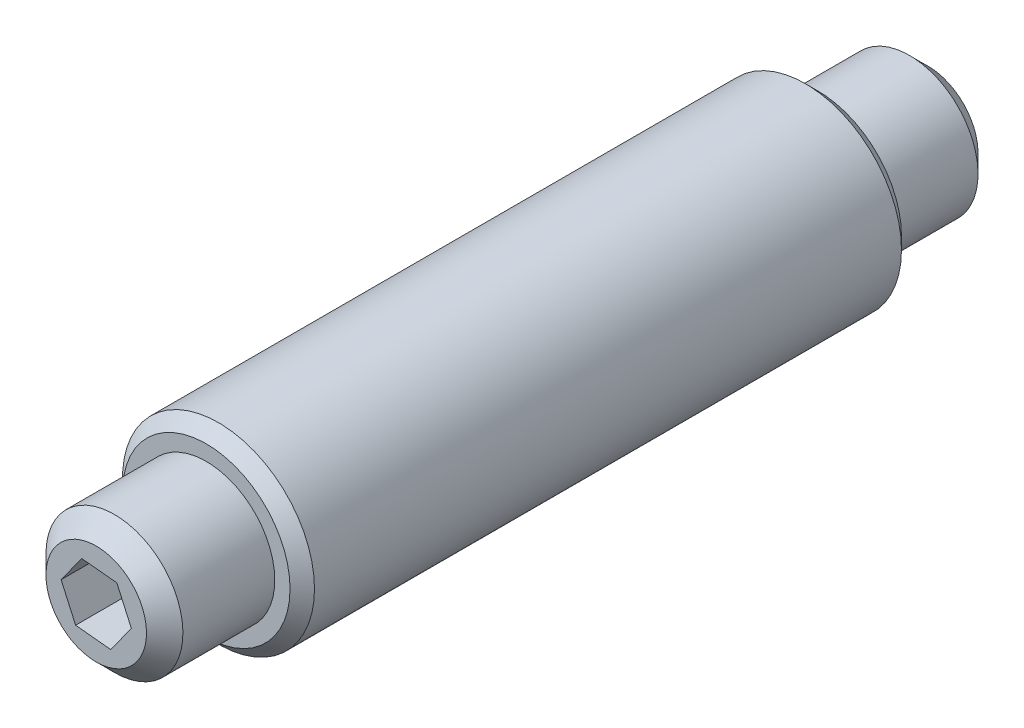
ISO-10303-21;
HEADER;
FILE_DESCRIPTION(('STEP AP214'),'2;1');
FILE_NAME('part.step','',(''),(''),'','','');
FILE_SCHEMA(('AUTOMOTIVE_DESIGN { 1 0 10303 214 1 1 1 1 }'));
ENDSEC;
DATA;
#1=APPLICATION_CONTEXT('core data for automotive mechanical design processes');
#2=APPLICATION_PROTOCOL_DEFINITION('international standard','automotive_design',2000,#1);
#3=PRODUCT_CONTEXT('',#1,'mechanical');
#4=PRODUCT('Part','Part','',(#3));
#5=PRODUCT_RELATED_PRODUCT_CATEGORY('part','',(#4));
#6=PRODUCT_DEFINITION_FORMATION('','',#4);
#7=PRODUCT_DEFINITION_CONTEXT('part definition',#1,'design');
#8=PRODUCT_DEFINITION('design','',#6,#7);
#9=PRODUCT_DEFINITION_SHAPE('','',#8);
#10=(LENGTH_UNIT() NAMED_UNIT(*) SI_UNIT(.MILLI.,.METRE.));
#11=(NAMED_UNIT(*) PLANE_ANGLE_UNIT() SI_UNIT($,.RADIAN.));
#12=(NAMED_UNIT(*) SI_UNIT($,.STERADIAN.) SOLID_ANGLE_UNIT());
#13=UNCERTAINTY_MEASURE_WITH_UNIT(LENGTH_MEASURE(1.E-05),#10,'distance_accuracy_value','');
#14=(GEOMETRIC_REPRESENTATION_CONTEXT(3) GLOBAL_UNCERTAINTY_ASSIGNED_CONTEXT((#13)) GLOBAL_UNIT_ASSIGNED_CONTEXT((#10,
#11,#12)) REPRESENTATION_CONTEXT('',''));
#15=CARTESIAN_POINT('',(0.,0.,0.));
#16=DIRECTION('',(0.,0.,1.));
#17=DIRECTION('',(1.,0.,0.));
#18=AXIS2_PLACEMENT_3D('',#15,#16,#17);
#19=CARTESIAN_POINT('',(0.,0.,6.35));
#20=DIRECTION('',(0.,0.,-1.));
#21=DIRECTION('',(-1.,0.,0.));
#22=AXIS2_PLACEMENT_3D('',#19,#20,#21);
#23=CYLINDRICAL_SURFACE('',#22,1.9939);
#24=CARTESIAN_POINT('',(0.,0.,-6.096));
#25=DIRECTION('',(0.,0.,1.));
#26=DIRECTION('',(1.,0.,0.));
#27=AXIS2_PLACEMENT_3D('',#24,#25,#26);
#28=CIRCLE('',#27,1.9939);
#29=CARTESIAN_POINT('',(1.9939,0.,-6.096));
#30=VERTEX_POINT('',#29);
#31=EDGE_CURVE('P0_E25',#30,#30,#28,.T.);
#32=ORIENTED_EDGE('',*,*,#31,.T.);
#33=EDGE_LOOP('',(#32));
#34=FACE_BOUND('',#33,.T.);
#35=CARTESIAN_POINT('',(0.,0.,6.096));
#36=DIRECTION('',(0.,0.,1.));
#37=DIRECTION('',(1.,0.,0.));
#38=AXIS2_PLACEMENT_3D('',#35,#36,#37);
#39=CIRCLE('',#38,1.9939);
#40=CARTESIAN_POINT('',(1.9939,0.,6.096));
#41=VERTEX_POINT('',#40);
#42=EDGE_CURVE('P0_E66',#41,#41,#39,.F.);
#43=ORIENTED_EDGE('',*,*,#42,.T.);
#44=EDGE_LOOP('',(#43));
#45=FACE_BOUND('',#44,.T.);
#46=ADVANCED_FACE('P0_F17',(#34,#45),#23,.T.);
#47=CARTESIAN_POINT('',(0.,0.,6.35));
#48=DIRECTION('',(0.,0.,1.));
#49=DIRECTION('',(1.,0.,0.));
#50=AXIS2_PLACEMENT_3D('',#47,#48,#49);
#51=PLANE('',#50);
#52=CARTESIAN_POINT('',(0.,0.,6.35));
#53=DIRECTION('',(0.,0.,1.));
#54=DIRECTION('',(1.,0.,0.));
#55=AXIS2_PLACEMENT_3D('',#52,#53,#54);
#56=CIRCLE('',#55,1.4224);
#57=CARTESIAN_POINT('',(1.4224,0.,6.35));
#58=VERTEX_POINT('',#57);
#59=EDGE_CURVE('P0_E60',#58,#58,#56,.T.);
#60=ORIENTED_EDGE('',*,*,#59,.F.);
#61=EDGE_LOOP('',(#60));
#62=FACE_BOUND('',#61,.T.);
#63=CARTESIAN_POINT('',(0.,0.,6.35));
#64=DIRECTION('',(0.,0.,1.));
#65=DIRECTION('',(1.,0.,0.));
#66=AXIS2_PLACEMENT_3D('',#63,#64,#65);
#67=CIRCLE('',#66,1.7399);
#68=CARTESIAN_POINT('',(1.7399,0.,6.35));
#69=VERTEX_POINT('',#68);
#70=EDGE_CURVE('P0_E63',#69,#69,#67,.T.);
#71=ORIENTED_EDGE('',*,*,#70,.T.);
#72=EDGE_LOOP('',(#71));
#73=FACE_BOUND('',#72,.T.);
#74=ADVANCED_FACE('P0_F81',(#62,#73),#51,.T.);
#75=CARTESIAN_POINT('',(0.,0.,-6.35));
#76=DIRECTION('',(0.,0.,1.));
#77=DIRECTION('',(1.,0.,0.));
#78=AXIS2_PLACEMENT_3D('',#75,#76,#77);
#79=PLANE('',#78);
#80=CARTESIAN_POINT('',(0.,0.,-6.35));
#81=DIRECTION('',(0.,0.,1.));
#82=DIRECTION('',(1.,0.,0.));
#83=AXIS2_PLACEMENT_3D('',#80,#81,#82);
#84=CIRCLE('',#83,1.7399);
#85=CARTESIAN_POINT('',(1.7399,0.,-6.35));
#86=VERTEX_POINT('',#85);
#87=EDGE_CURVE('P0_E11',#86,#86,#84,.F.);
#88=ORIENTED_EDGE('',*,*,#87,.T.);
#89=EDGE_LOOP('',(#88));
#90=FACE_BOUND('',#89,.T.);
#91=CARTESIAN_POINT('',(0.,0.,-6.35));
#92=DIRECTION('',(0.,0.,-1.));
#93=DIRECTION('',(-1.,0.,0.));
#94=AXIS2_PLACEMENT_3D('',#91,#92,#93);
#95=CIRCLE('',#94,1.4224);
#96=CARTESIAN_POINT('',(-1.4224,0.,-6.35));
#97=VERTEX_POINT('',#96);
#98=EDGE_CURVE('P0_E48',#97,#97,#95,.T.);
#99=ORIENTED_EDGE('',*,*,#98,.F.);
#100=EDGE_LOOP('',(#99));
#101=FACE_BOUND('',#100,.T.);
#102=ADVANCED_FACE('P0_F87',(#90,#101),#79,.F.);
#103=CARTESIAN_POINT('',(0.,0.,6.35));
#104=DIRECTION('',(0.,0.,-1.));
#105=DIRECTION('',(-1.,0.,0.));
#106=AXIS2_PLACEMENT_3D('',#103,#104,#105);
#107=CONICAL_SURFACE('',#106,1.7399,0.785398163397448);
#108=ORIENTED_EDGE('',*,*,#42,.F.);
#109=EDGE_LOOP('',(#108));
#110=FACE_BOUND('',#109,.T.);
#111=ORIENTED_EDGE('',*,*,#70,.F.);
#112=EDGE_LOOP('',(#111));
#113=FACE_BOUND('',#112,.T.);
#114=ADVANCED_FACE('P0_F91',(#110,#113),#107,.T.);
#115=CARTESIAN_POINT('',(0.,0.,6.35));
#116=DIRECTION('',(0.,0.,1.));
#117=DIRECTION('',(1.,0.,0.));
#118=AXIS2_PLACEMENT_3D('',#115,#116,#117);
#119=CYLINDRICAL_SURFACE('',#118,1.4224);
#120=CARTESIAN_POINT('',(0.,0.,2.286));
#121=DIRECTION('',(0.,0.,1.));
#122=DIRECTION('',(1.,0.,0.));
#123=AXIS2_PLACEMENT_3D('',#120,#121,#122);
#124=CIRCLE('',#123,1.4224);
#125=CARTESIAN_POINT('',(1.4224,0.,2.286));
#126=VERTEX_POINT('',#125);
#127=EDGE_CURVE('P0_E57',#126,#126,#124,.T.);
#128=ORIENTED_EDGE('',*,*,#127,.F.);
#129=EDGE_LOOP('',(#128));
#130=FACE_BOUND('',#129,.T.);
#131=ORIENTED_EDGE('',*,*,#59,.T.);
#132=EDGE_LOOP('',(#131));
#133=FACE_BOUND('',#132,.T.);
#134=ADVANCED_FACE('P0_F93',(#130,#133),#119,.F.);
#135=CARTESIAN_POINT('',(1.1303,0.,2.286));
#136=DIRECTION('',(0.,0.,-1.));
#137=DIRECTION('',(-1.,0.,0.));
#138=AXIS2_PLACEMENT_3D('',#135,#136,#137);
#139=PLANE('',#138);
#140=CARTESIAN_POINT('',(0.,0.,2.286));
#141=DIRECTION('',(0.,0.,1.));
#142=DIRECTION('',(1.,0.,0.));
#143=AXIS2_PLACEMENT_3D('',#140,#141,#142);
#144=CIRCLE('',#143,1.1303);
#145=CARTESIAN_POINT('',(1.1303,0.,2.286));
#146=VERTEX_POINT('',#145);
#147=EDGE_CURVE('P0_E54',#146,#146,#144,.T.);
#148=ORIENTED_EDGE('',*,*,#147,.F.);
#149=EDGE_LOOP('',(#148));
#150=FACE_BOUND('',#149,.T.);
#151=ORIENTED_EDGE('',*,*,#127,.T.);
#152=EDGE_LOOP('',(#151));
#153=FACE_BOUND('',#152,.T.);
#154=ADVANCED_FACE('P0_F100',(#150,#153),#139,.F.);
#155=CARTESIAN_POINT('',(0.,0.,6.35));
#156=DIRECTION('',(0.,0.,1.));
#157=DIRECTION('',(1.,0.,0.));
#158=AXIS2_PLACEMENT_3D('',#155,#156,#157);
#159=CYLINDRICAL_SURFACE('',#158,1.1303);
#160=CARTESIAN_POINT('',(0.,0.,1.27));
#161=DIRECTION('',(0.,0.,1.));
#162=DIRECTION('',(1.,0.,0.));
#163=AXIS2_PLACEMENT_3D('',#160,#161,#162);
#164=CIRCLE('',#163,1.1303);
#165=CARTESIAN_POINT('',(1.1303,0.,1.27));
#166=VERTEX_POINT('',#165);
#167=EDGE_CURVE('P0_E51',#166,#166,#164,.T.);
#168=ORIENTED_EDGE('',*,*,#167,.F.);
#169=EDGE_LOOP('',(#168));
#170=FACE_BOUND('',#169,.T.);
#171=ORIENTED_EDGE('',*,*,#147,.T.);
#172=EDGE_LOOP('',(#171));
#173=FACE_BOUND('',#172,.T.);
#174=ADVANCED_FACE('P0_F115',(#170,#173),#159,.F.);
#175=CARTESIAN_POINT('',(0.,0.,1.27));
#176=DIRECTION('',(0.,0.,1.));
#177=DIRECTION('',(1.,0.,0.));
#178=AXIS2_PLACEMENT_3D('',#175,#176,#177);
#179=CONICAL_SURFACE('',#178,1.1303,1.02974425867665);
#180=CARTESIAN_POINT('',(0.,0.,0.590847242313148));
#181=VERTEX_POINT('',#180);
#182=VERTEX_LOOP('',#181);
#183=FACE_BOUND('',#182,.T.);
#184=ORIENTED_EDGE('',*,*,#167,.T.);
#185=EDGE_LOOP('',(#184));
#186=FACE_BOUND('',#185,.T.);
#187=ADVANCED_FACE('P0_F119',(#183,#186),#179,.F.);
#188=CARTESIAN_POINT('',(0.,0.,-6.35));
#189=DIRECTION('',(0.,0.,-1.));
#190=DIRECTION('',(-1.,0.,0.));
#191=AXIS2_PLACEMENT_3D('',#188,#189,#190);
#192=CYLINDRICAL_SURFACE('',#191,1.4224);
#193=CARTESIAN_POINT('',(0.,0.,-2.286));
#194=DIRECTION('',(0.,0.,-1.));
#195=DIRECTION('',(-1.,0.,0.));
#196=AXIS2_PLACEMENT_3D('',#193,#194,#195);
#197=CIRCLE('',#196,1.4224);
#198=CARTESIAN_POINT('',(-1.4224,0.,-2.286));
#199=VERTEX_POINT('',#198);
#200=EDGE_CURVE('P0_E43',#199,#199,#197,.T.);
#201=ORIENTED_EDGE('',*,*,#200,.F.);
#202=EDGE_LOOP('',(#201));
#203=FACE_BOUND('',#202,.T.);
#204=ORIENTED_EDGE('',*,*,#98,.T.);
#205=EDGE_LOOP('',(#204));
#206=FACE_BOUND('',#205,.T.);
#207=ADVANCED_FACE('P0_F123',(#203,#206),#192,.F.);
#208=CARTESIAN_POINT('',(1.1303,0.,-2.286));
#209=DIRECTION('',(0.,0.,1.));
#210=DIRECTION('',(1.,0.,0.));
#211=AXIS2_PLACEMENT_3D('',#208,#209,#210);
#212=PLANE('',#211);
#213=CARTESIAN_POINT('',(0.,0.,-2.286));
#214=DIRECTION('',(0.,0.,-1.));
#215=DIRECTION('',(-1.,0.,0.));
#216=AXIS2_PLACEMENT_3D('',#213,#214,#215);
#217=CIRCLE('',#216,1.1303);
#218=CARTESIAN_POINT('',(-1.1303,0.,-2.286));
#219=VERTEX_POINT('',#218);
#220=EDGE_CURVE('P0_E40',#219,#219,#217,.T.);
#221=ORIENTED_EDGE('',*,*,#220,.F.);
#222=EDGE_LOOP('',(#221));
#223=FACE_BOUND('',#222,.T.);
#224=ORIENTED_EDGE('',*,*,#200,.T.);
#225=EDGE_LOOP('',(#224));
#226=FACE_BOUND('',#225,.T.);
#227=ADVANCED_FACE('P0_F126',(#223,#226),#212,.F.);
#228=CARTESIAN_POINT('',(0.,0.,-6.35));
#229=DIRECTION('',(0.,0.,-1.));
#230=DIRECTION('',(-1.,0.,0.));
#231=AXIS2_PLACEMENT_3D('',#228,#229,#230);
#232=CYLINDRICAL_SURFACE('',#231,1.1303);
#233=CARTESIAN_POINT('',(0.,0.,-1.27));
#234=DIRECTION('',(0.,0.,-1.));
#235=DIRECTION('',(-1.,0.,0.));
#236=AXIS2_PLACEMENT_3D('',#233,#234,#235);
#237=CIRCLE('',#236,1.1303);
#238=CARTESIAN_POINT('',(-1.1303,0.,-1.27));
#239=VERTEX_POINT('',#238);
#240=EDGE_CURVE('P0_E38',#239,#239,#237,.T.);
#241=ORIENTED_EDGE('',*,*,#240,.F.);
#242=EDGE_LOOP('',(#241));
#243=FACE_BOUND('',#242,.T.);
#244=ORIENTED_EDGE('',*,*,#220,.T.);
#245=EDGE_LOOP('',(#244));
#246=FACE_BOUND('',#245,.T.);
#247=ADVANCED_FACE('P0_F34',(#243,#246),#232,.F.);
#248=CARTESIAN_POINT('',(0.,0.,-1.27));
#249=DIRECTION('',(0.,0.,-1.));
#250=DIRECTION('',(-1.,0.,0.));
#251=AXIS2_PLACEMENT_3D('',#248,#249,#250);
#252=CONICAL_SURFACE('',#251,1.1303,1.02974425867665);
#253=CARTESIAN_POINT('',(0.,0.,-0.590847242313148));
#254=VERTEX_POINT('',#253);
#255=VERTEX_LOOP('',#254);
#256=FACE_BOUND('',#255,.T.);
#257=ORIENTED_EDGE('',*,*,#240,.T.);
#258=EDGE_LOOP('',(#257));
#259=FACE_BOUND('',#258,.T.);
#260=ADVANCED_FACE('P0_F31',(#256,#259),#252,.F.);
#261=CARTESIAN_POINT('',(0.,0.,-6.096));
#262=DIRECTION('',(0.,0.,1.));
#263=DIRECTION('',(1.,0.,0.));
#264=AXIS2_PLACEMENT_3D('',#261,#262,#263);
#265=CONICAL_SURFACE('',#264,1.9939,0.785398163397448);
#266=ORIENTED_EDGE('',*,*,#87,.F.);
#267=EDGE_LOOP('',(#266));
#268=FACE_BOUND('',#267,.T.);
#269=ORIENTED_EDGE('',*,*,#31,.F.);
#270=EDGE_LOOP('',(#269));
#271=FACE_BOUND('',#270,.T.);
#272=ADVANCED_FACE('P0_F19',(#268,#271),#265,.T.);
#273=CLOSED_SHELL('',(#46,#74,#102,#114,#134,#154,#174,#187,#207,#227,#247,#260,#272));
#274=MANIFOLD_SOLID_BREP('P0_B1',#273);
#275=CARTESIAN_POINT('',(0.,0.,-8.636));
#276=DIRECTION('',(0.,0.,-1.));
#277=DIRECTION('',(-0.761416587019638,-0.648262894982711,0.));
#278=AXIS2_PLACEMENT_3D('',#275,#276,#277);
#279=PLANE('',#278);
#280=CARTESIAN_POINT('',(0.,0.,-8.636));
#281=DIRECTION('',(0.,0.,-1.));
#282=DIRECTION('',(-0.761416587019638,-0.648262894982711,0.));
#283=AXIS2_PLACEMENT_3D('',#280,#281,#282);
#284=CIRCLE('',#283,1.04394);
#285=CARTESIAN_POINT('',(-0.794873231853282,-0.676747566588252,-8.636));
#286=VERTEX_POINT('',#285);
#287=EDGE_CURVE('P1_E11',#286,#286,#284,.T.);
#288=ORIENTED_EDGE('',*,*,#287,.T.);
#289=EDGE_LOOP('',(#288));
#290=FACE_BOUND('',#289,.T.);
#291=DIRECTION('',(0.761416587019639,0.648262894982711,0.));
#292=VECTOR('',#291,1.);
#293=CARTESIAN_POINT('',(-0.690795523704608,0.245835062110788,-8.636));
#294=LINE('',#293,#292);
#295=CARTESIAN_POINT('',(-0.690795523704608,0.245835062110788,-8.636));
#296=VERTEX_POINT('',#295);
#297=CARTESIAN_POINT('',(-0.132498352923441,0.721164003404159,-8.636));
#298=VERTEX_POINT('',#297);
#299=EDGE_CURVE('P1_E78',#296,#298,#294,.T.);
#300=ORIENTED_EDGE('',*,*,#299,.F.);
#301=DIRECTION('',(0.180703841876052,-0.983537554713207,0.));
#302=VECTOR('',#301,1.);
#303=CARTESIAN_POINT('',(-0.690795523704608,0.245835062110788,-8.636));
#304=LINE('',#303,#302);
#305=CARTESIAN_POINT('',(-0.558297170781171,-0.475328941293368,-8.636));
#306=VERTEX_POINT('',#305);
#307=EDGE_CURVE('P1_E31',#296,#306,#304,.T.);
#308=ORIENTED_EDGE('',*,*,#307,.T.);
#309=DIRECTION('',(-0.942120428895691,0.335274659730496,0.));
#310=VECTOR('',#309,1.);
#311=CARTESIAN_POINT('',(0.132498352923435,-0.721164003404153,-8.636));
#312=LINE('',#311,#310);
#313=CARTESIAN_POINT('',(0.132498352923435,-0.721164003404153,-8.636));
#314=VERTEX_POINT('',#313);
#315=EDGE_CURVE('P1_E84',#314,#306,#312,.T.);
#316=ORIENTED_EDGE('',*,*,#315,.F.);
#317=DIRECTION('',(0.761416587019638,0.648262894982711,0.));
#318=VECTOR('',#317,1.);
#319=CARTESIAN_POINT('',(0.132498352923435,-0.721164003404153,-8.636));
#320=LINE('',#319,#318);
#321=CARTESIAN_POINT('',(0.690795523704602,-0.245835062110782,-8.636));
#322=VERTEX_POINT('',#321);
#323=EDGE_CURVE('P1_E104',#314,#322,#320,.T.);
#324=ORIENTED_EDGE('',*,*,#323,.T.);
#325=DIRECTION('',(-0.180703841876052,0.983537554713207,0.));
#326=VECTOR('',#325,1.);
#327=CARTESIAN_POINT('',(0.690795523704602,-0.245835062110782,-8.636));
#328=LINE('',#327,#326);
#329=CARTESIAN_POINT('',(0.558297170781164,0.475328941293374,-8.636));
#330=VERTEX_POINT('',#329);
#331=EDGE_CURVE('P1_E107',#322,#330,#328,.T.);
#332=ORIENTED_EDGE('',*,*,#331,.T.);
#333=DIRECTION('',(0.942120428895691,-0.335274659730496,0.));
#334=VECTOR('',#333,1.);
#335=CARTESIAN_POINT('',(-0.132498352923441,0.721164003404159,-8.636));
#336=LINE('',#335,#334);
#337=EDGE_CURVE('P1_E110',#298,#330,#336,.T.);
#338=ORIENTED_EDGE('',*,*,#337,.F.);
#339=EDGE_LOOP('',(#300,#308,#316,#324,#332,#338));
#340=FACE_BOUND('',#339,.T.);
#341=ADVANCED_FACE('P1_F17',(#290,#340),#279,.T.);
#342=CARTESIAN_POINT('',(0.,0.,-8.636));
#343=DIRECTION('',(0.,0.,1.));
#344=DIRECTION('',(0.761416587019638,0.648262894982711,0.));
#345=AXIS2_PLACEMENT_3D('',#342,#343,#344);
#346=CONICAL_SURFACE('',#345,1.04394,0.785398163397426);
#347=CARTESIAN_POINT('',(0.,0.,-8.25753999999998));
#348=DIRECTION('',(0.,0.,-1.));
#349=DIRECTION('',(-0.761416587019638,-0.648262894982711,0.));
#350=AXIS2_PLACEMENT_3D('',#347,#348,#349);
#351=CIRCLE('',#350,1.4224);
#352=CARTESIAN_POINT('',(-1.08303895337673,-0.922089141823408,-8.25753999999998));
#353=VERTEX_POINT('',#352);
#354=EDGE_CURVE('P1_E24',#353,#353,#351,.T.);
#355=ORIENTED_EDGE('',*,*,#354,.T.);
#356=EDGE_LOOP('',(#355));
#357=FACE_BOUND('',#356,.T.);
#358=ORIENTED_EDGE('',*,*,#287,.F.);
#359=EDGE_LOOP('',(#358));
#360=FACE_BOUND('',#359,.T.);
#361=ADVANCED_FACE('P1_F130',(#357,#360),#346,.T.);
#362=CARTESIAN_POINT('',(0.,0.,-21.336));
#363=DIRECTION('',(0.,0.,-1.));
#364=DIRECTION('',(-0.761416587019638,-0.648262894982711,0.));
#365=AXIS2_PLACEMENT_3D('',#362,#363,#364);
#366=CYLINDRICAL_SURFACE('',#365,1.4224);
#367=CARTESIAN_POINT('',(0.,0.,-5.83494976935411));
#368=DIRECTION('',(0.,0.,-1.));
#369=DIRECTION('',(-0.761416587019638,-0.648262894982711,0.));
#370=AXIS2_PLACEMENT_3D('',#367,#368,#369);
#371=CIRCLE('',#370,1.4224);
#372=CARTESIAN_POINT('',(-1.08303895337673,-0.922089141823408,-5.83494976935411));
#373=VERTEX_POINT('',#372);
#374=EDGE_CURVE('P1_E125',#373,#373,#371,.T.);
#375=ORIENTED_EDGE('',*,*,#374,.T.);
#376=EDGE_LOOP('',(#375));
#377=FACE_BOUND('',#376,.T.);
#378=ORIENTED_EDGE('',*,*,#354,.F.);
#379=EDGE_LOOP('',(#378));
#380=FACE_BOUND('',#379,.T.);
#381=ADVANCED_FACE('P1_F133',(#377,#380),#366,.T.);
#382=CARTESIAN_POINT('',(0.,0.,-5.83494976935411));
#383=DIRECTION('',(0.,0.,-1.));
#384=DIRECTION('',(-0.761416587019638,-0.648262894982711,0.));
#385=AXIS2_PLACEMENT_3D('',#382,#383,#384);
#386=CONICAL_SURFACE('',#385,1.4224,1.0471975511966);
#387=CARTESIAN_POINT('',(0.,0.,-5.461));
#388=DIRECTION('',(0.,0.,-1.));
#389=DIRECTION('',(-0.761416587019638,-0.648262894982711,0.));
#390=AXIS2_PLACEMENT_3D('',#387,#388,#389);
#391=CIRCLE('',#390,0.7747);
#392=CARTESIAN_POINT('',(-0.589869429964114,-0.502209264743106,-5.461));
#393=VERTEX_POINT('',#392);
#394=EDGE_CURVE('P1_E85',#393,#393,#391,.T.);
#395=ORIENTED_EDGE('',*,*,#394,.T.);
#396=EDGE_LOOP('',(#395));
#397=FACE_BOUND('',#396,.T.);
#398=ORIENTED_EDGE('',*,*,#374,.F.);
#399=EDGE_LOOP('',(#398));
#400=FACE_BOUND('',#399,.T.);
#401=ADVANCED_FACE('P1_F135',(#397,#400),#386,.T.);
#402=CARTESIAN_POINT('',(0.,0.,-5.92648672156064));
#403=DIRECTION('',(0.,0.,1.));
#404=DIRECTION('',(0.761416587019638,0.648262894982711,0.));
#405=AXIS2_PLACEMENT_3D('',#402,#403,#404);
#406=CONICAL_SURFACE('',#405,0.,1.02974425867666);
#407=ORIENTED_EDGE('',*,*,#394,.F.);
#408=EDGE_LOOP('',(#407));
#409=FACE_BOUND('',#408,.T.);
#410=CARTESIAN_POINT('',(0.,0.,-5.92648672156064));
#411=VERTEX_POINT('',#410);
#412=VERTEX_LOOP('',#411);
#413=FACE_BOUND('',#412,.T.);
#414=ADVANCED_FACE('P1_F143',(#409,#413),#406,.F.);
#415=CARTESIAN_POINT('',(-0.690795523704608,0.245835062110788,-6.858));
#416=DIRECTION('',(0.983537554713207,0.180703841876052,0.));
#417=DIRECTION('',(-0.180703841876052,0.983537554713207,0.));
#418=AXIS2_PLACEMENT_3D('',#415,#416,#417);
#419=PLANE('',#418);
#420=ORIENTED_EDGE('',*,*,#307,.F.);
#421=DIRECTION('',(0.,0.,-1.));
#422=VECTOR('',#421,1.);
#423=CARTESIAN_POINT('',(-0.690795523704608,0.245835062110788,-6.858));
#424=LINE('',#423,#422);
#425=CARTESIAN_POINT('',(-0.690795523704608,0.245835062110788,-6.858));
#426=VERTEX_POINT('',#425);
#427=EDGE_CURVE('P1_E72',#426,#296,#424,.T.);
#428=ORIENTED_EDGE('',*,*,#427,.F.);
#429=DIRECTION('',(0.180703841876052,-0.983537554713207,0.));
#430=VECTOR('',#429,1.);
#431=CARTESIAN_POINT('',(-0.690795523704608,0.245835062110788,-6.858));
#432=LINE('',#431,#430);
#433=CARTESIAN_POINT('',(-0.558297170781171,-0.475328941293368,-6.858));
#434=VERTEX_POINT('',#433);
#435=EDGE_CURVE('P1_E67',#426,#434,#432,.T.);
#436=ORIENTED_EDGE('',*,*,#435,.T.);
#437=DIRECTION('',(0.,0.,-1.));
#438=VECTOR('',#437,1.);
#439=CARTESIAN_POINT('',(-0.558297170781171,-0.475328941293368,-6.858));
#440=LINE('',#439,#438);
#441=EDGE_CURVE('P1_E70',#434,#306,#440,.T.);
#442=ORIENTED_EDGE('',*,*,#441,.T.);
#443=EDGE_LOOP('',(#420,#428,#436,#442));
#444=FACE_BOUND('',#443,.T.);
#445=ADVANCED_FACE('P1_F69',(#444),#419,.T.);
#446=CARTESIAN_POINT('',(0.132498352923435,-0.721164003404153,-6.858));
#447=DIRECTION('',(-0.335274659730496,-0.942120428895691,0.));
#448=DIRECTION('',(0.942120428895691,-0.335274659730496,0.));
#449=AXIS2_PLACEMENT_3D('',#446,#447,#448);
#450=PLANE('',#449);
#451=ORIENTED_EDGE('',*,*,#315,.T.);
#452=ORIENTED_EDGE('',*,*,#441,.F.);
#453=DIRECTION('',(-0.942120428895691,0.335274659730496,0.));
#454=VECTOR('',#453,1.);
#455=CARTESIAN_POINT('',(0.132498352923435,-0.721164003404153,-6.858));
#456=LINE('',#455,#454);
#457=CARTESIAN_POINT('',(0.132498352923435,-0.721164003404153,-6.858));
#458=VERTEX_POINT('',#457);
#459=EDGE_CURVE('P1_E77',#458,#434,#456,.T.);
#460=ORIENTED_EDGE('',*,*,#459,.F.);
#461=DIRECTION('',(0.,0.,-1.));
#462=VECTOR('',#461,1.);
#463=CARTESIAN_POINT('',(0.132498352923435,-0.721164003404153,-6.858));
#464=LINE('',#463,#462);
#465=EDGE_CURVE('P1_E86',#458,#314,#464,.T.);
#466=ORIENTED_EDGE('',*,*,#465,.T.);
#467=EDGE_LOOP('',(#451,#452,#460,#466));
#468=FACE_BOUND('',#467,.T.);
#469=ADVANCED_FACE('P1_F82',(#468),#450,.F.);
#470=CARTESIAN_POINT('',(0.132498352923435,-0.721164003404153,-6.858));
#471=DIRECTION('',(-0.648262894982711,0.761416587019638,0.));
#472=DIRECTION('',(-0.761416587019638,-0.648262894982711,0.));
#473=AXIS2_PLACEMENT_3D('',#470,#471,#472);
#474=PLANE('',#473);
#475=ORIENTED_EDGE('',*,*,#323,.F.);
#476=ORIENTED_EDGE('',*,*,#465,.F.);
#477=DIRECTION('',(0.761416587019638,0.648262894982711,0.));
#478=VECTOR('',#477,1.);
#479=CARTESIAN_POINT('',(0.132498352923435,-0.721164003404153,-6.858));
#480=LINE('',#479,#478);
#481=CARTESIAN_POINT('',(0.690795523704602,-0.245835062110782,-6.858));
#482=VERTEX_POINT('',#481);
#483=EDGE_CURVE('P1_E91',#458,#482,#480,.T.);
#484=ORIENTED_EDGE('',*,*,#483,.T.);
#485=DIRECTION('',(0.,0.,-1.));
#486=VECTOR('',#485,1.);
#487=CARTESIAN_POINT('',(0.690795523704602,-0.245835062110782,-6.858));
#488=LINE('',#487,#486);
#489=EDGE_CURVE('P1_E120',#482,#322,#488,.T.);
#490=ORIENTED_EDGE('',*,*,#489,.T.);
#491=EDGE_LOOP('',(#475,#476,#484,#490));
#492=FACE_BOUND('',#491,.T.);
#493=ADVANCED_FACE('P1_F166',(#492),#474,.T.);
#494=CARTESIAN_POINT('',(0.690795523704602,-0.245835062110782,-6.858));
#495=DIRECTION('',(-0.983537554713207,-0.180703841876052,0.));
#496=DIRECTION('',(0.180703841876052,-0.983537554713207,0.));
#497=AXIS2_PLACEMENT_3D('',#494,#495,#496);
#498=PLANE('',#497);
#499=ORIENTED_EDGE('',*,*,#331,.F.);
#500=ORIENTED_EDGE('',*,*,#489,.F.);
#501=DIRECTION('',(-0.180703841876052,0.983537554713207,0.));
#502=VECTOR('',#501,1.);
#503=CARTESIAN_POINT('',(0.690795523704602,-0.245835062110782,-6.858));
#504=LINE('',#503,#502);
#505=CARTESIAN_POINT('',(0.558297170781164,0.475328941293374,-6.858));
#506=VERTEX_POINT('',#505);
#507=EDGE_CURVE('P1_E93',#482,#506,#504,.T.);
#508=ORIENTED_EDGE('',*,*,#507,.T.);
#509=DIRECTION('',(0.,0.,-1.));
#510=VECTOR('',#509,1.);
#511=CARTESIAN_POINT('',(0.558297170781164,0.475328941293374,-6.858));
#512=LINE('',#511,#510);
#513=EDGE_CURVE('P1_E118',#506,#330,#512,.T.);
#514=ORIENTED_EDGE('',*,*,#513,.T.);
#515=EDGE_LOOP('',(#499,#500,#508,#514));
#516=FACE_BOUND('',#515,.T.);
#517=ADVANCED_FACE('P1_F162',(#516),#498,.T.);
#518=CARTESIAN_POINT('',(-0.132498352923441,0.721164003404159,-6.858));
#519=DIRECTION('',(0.335274659730496,0.942120428895691,0.));
#520=DIRECTION('',(-0.942120428895691,0.335274659730496,0.));
#521=AXIS2_PLACEMENT_3D('',#518,#519,#520);
#522=PLANE('',#521);
#523=ORIENTED_EDGE('',*,*,#337,.T.);
#524=ORIENTED_EDGE('',*,*,#513,.F.);
#525=DIRECTION('',(0.942120428895691,-0.335274659730496,0.));
#526=VECTOR('',#525,1.);
#527=CARTESIAN_POINT('',(-0.132498352923441,0.721164003404159,-6.858));
#528=LINE('',#527,#526);
#529=CARTESIAN_POINT('',(-0.132498352923441,0.721164003404159,-6.858));
#530=VERTEX_POINT('',#529);
#531=EDGE_CURVE('P1_E97',#530,#506,#528,.T.);
#532=ORIENTED_EDGE('',*,*,#531,.F.);
#533=DIRECTION('',(0.,0.,-1.));
#534=VECTOR('',#533,1.);
#535=CARTESIAN_POINT('',(-0.132498352923441,0.721164003404159,-6.858));
#536=LINE('',#535,#534);
#537=EDGE_CURVE('P1_E116',#530,#298,#536,.T.);
#538=ORIENTED_EDGE('',*,*,#537,.T.);
#539=EDGE_LOOP('',(#523,#524,#532,#538));
#540=FACE_BOUND('',#539,.T.);
#541=ADVANCED_FACE('P1_F159',(#540),#522,.F.);
#542=CARTESIAN_POINT('',(-0.690795523704608,0.245835062110788,-6.858));
#543=DIRECTION('',(-0.648262894982711,0.761416587019639,0.));
#544=DIRECTION('',(-0.761416587019639,-0.648262894982711,0.));
#545=AXIS2_PLACEMENT_3D('',#542,#543,#544);
#546=PLANE('',#545);
#547=ORIENTED_EDGE('',*,*,#299,.T.);
#548=ORIENTED_EDGE('',*,*,#537,.F.);
#549=DIRECTION('',(0.761416587019639,0.648262894982711,0.));
#550=VECTOR('',#549,1.);
#551=CARTESIAN_POINT('',(-0.690795523704608,0.245835062110788,-6.858));
#552=LINE('',#551,#550);
#553=EDGE_CURVE('P1_E100',#426,#530,#552,.T.);
#554=ORIENTED_EDGE('',*,*,#553,.F.);
#555=ORIENTED_EDGE('',*,*,#427,.T.);
#556=EDGE_LOOP('',(#547,#548,#554,#555));
#557=FACE_BOUND('',#556,.T.);
#558=ADVANCED_FACE('P1_F155',(#557),#546,.F.);
#559=CARTESIAN_POINT('',(-0.558297170781171,-0.475328941293368,-6.858));
#560=DIRECTION('',(0.,0.,-1.));
#561=DIRECTION('',(-0.761416587019638,-0.648262894982711,0.));
#562=AXIS2_PLACEMENT_3D('',#559,#560,#561);
#563=PLANE('',#562);
#564=ORIENTED_EDGE('',*,*,#435,.F.);
#565=ORIENTED_EDGE('',*,*,#553,.T.);
#566=ORIENTED_EDGE('',*,*,#531,.T.);
#567=ORIENTED_EDGE('',*,*,#507,.F.);
#568=ORIENTED_EDGE('',*,*,#483,.F.);
#569=ORIENTED_EDGE('',*,*,#459,.T.);
#570=EDGE_LOOP('',(#564,#565,#566,#567,#568,#569));
#571=FACE_BOUND('',#570,.T.);
#572=ADVANCED_FACE('P1_F89',(#571),#563,.T.);
#573=CLOSED_SHELL('',(#341,#361,#381,#401,#414,#445,#469,#493,#517,#541,#558,#572));
#574=MANIFOLD_SOLID_BREP('P1_B1',#573);
#575=CARTESIAN_POINT('',(0.,0.,8.636));
#576=DIRECTION('',(0.,0.,1.));
#577=DIRECTION('',(0.995012738844344,-0.0997479299909404,0.));
#578=AXIS2_PLACEMENT_3D('',#575,#576,#577);
#579=PLANE('',#578);
#580=CARTESIAN_POINT('',(0.,0.,8.636));
#581=DIRECTION('',(0.,0.,1.));
#582=DIRECTION('',(0.995012738844344,-0.0997479299909404,0.));
#583=AXIS2_PLACEMENT_3D('',#580,#581,#582);
#584=CIRCLE('',#583,1.04394);
#585=CARTESIAN_POINT('',(1.03873359858917,-0.104130854034742,8.636));
#586=VERTEX_POINT('',#585);
#587=EDGE_CURVE('P2_E10',#586,#586,#584,.T.);
#588=ORIENTED_EDGE('',*,*,#587,.T.);
#589=EDGE_LOOP('',(#588));
#590=FACE_BOUND('',#589,.T.);
#591=DIRECTION('',(-0.995012738844344,0.0997479299909403,0.));
#592=VECTOR('',#591,1.);
#593=CARTESIAN_POINT('',(0.428128939657242,0.595263760329238,8.636));
#594=LINE('',#593,#592);
#595=CARTESIAN_POINT('',(0.428128939657242,0.595263760329238,8.636));
#596=VERTEX_POINT('',#595);
#597=CARTESIAN_POINT('',(-0.301449068568746,0.668402418003087,8.636));
#598=VERTEX_POINT('',#597);
#599=EDGE_CURVE('P2_E77',#596,#598,#594,.T.);
#600=ORIENTED_EDGE('',*,*,#599,.F.);
#601=DIRECTION('',(0.411122128075106,-0.911580273923803,0.));
#602=VECTOR('',#601,1.);
#603=CARTESIAN_POINT('',(0.428128939657242,0.595263760329238,8.636));
#604=LINE('',#603,#602);
#605=CARTESIAN_POINT('',(0.72957800822599,-0.073138657673845,8.636));
#606=VERTEX_POINT('',#605);
#607=EDGE_CURVE('P2_E30',#596,#606,#604,.T.);
#608=ORIENTED_EDGE('',*,*,#607,.T.);
#609=DIRECTION('',(0.583890610769238,0.811832343932863,0.));
#610=VECTOR('',#609,1.);
#611=CARTESIAN_POINT('',(0.301449068568748,-0.668402418003079,8.636));
#612=LINE('',#611,#610);
#613=CARTESIAN_POINT('',(0.301449068568748,-0.668402418003079,8.636));
#614=VERTEX_POINT('',#613);
#615=EDGE_CURVE('P2_E83',#614,#606,#612,.T.);
#616=ORIENTED_EDGE('',*,*,#615,.F.);
#617=DIRECTION('',(-0.995012738844344,0.0997479299909404,0.));
#618=VECTOR('',#617,1.);
#619=CARTESIAN_POINT('',(0.301449068568748,-0.668402418003079,8.636));
#620=LINE('',#619,#618);
#621=CARTESIAN_POINT('',(-0.42812893965724,-0.595263760329229,8.636));
#622=VERTEX_POINT('',#621);
#623=EDGE_CURVE('P2_E103',#614,#622,#620,.T.);
#624=ORIENTED_EDGE('',*,*,#623,.T.);
#625=DIRECTION('',(-0.411122128075106,0.911580273923803,0.));
#626=VECTOR('',#625,1.);
#627=CARTESIAN_POINT('',(-0.42812893965724,-0.595263760329229,8.636));
#628=LINE('',#627,#626);
#629=CARTESIAN_POINT('',(-0.729578008225988,0.0731386576738534,8.636));
#630=VERTEX_POINT('',#629);
#631=EDGE_CURVE('P2_E106',#622,#630,#628,.T.);
#632=ORIENTED_EDGE('',*,*,#631,.T.);
#633=DIRECTION('',(-0.583890610769238,-0.811832343932863,0.));
#634=VECTOR('',#633,1.);
#635=CARTESIAN_POINT('',(-0.301449068568746,0.668402418003087,8.636));
#636=LINE('',#635,#634);
#637=EDGE_CURVE('P2_E109',#598,#630,#636,.T.);
#638=ORIENTED_EDGE('',*,*,#637,.F.);
#639=EDGE_LOOP('',(#600,#608,#616,#624,#632,#638));
#640=FACE_BOUND('',#639,.T.);
#641=ADVANCED_FACE('P2_F16',(#590,#640),#579,.T.);
#642=CARTESIAN_POINT('',(0.,0.,8.636));
#643=DIRECTION('',(0.,0.,-1.));
#644=DIRECTION('',(-0.995012738844344,0.0997479299909404,0.));
#645=AXIS2_PLACEMENT_3D('',#642,#643,#644);
#646=CONICAL_SURFACE('',#645,1.04394,0.785398163397426);
#647=CARTESIAN_POINT('',(0.,0.,8.25753999999998));
#648=DIRECTION('',(0.,0.,1.));
#649=DIRECTION('',(0.995012738844344,-0.0997479299909404,0.));
#650=AXIS2_PLACEMENT_3D('',#647,#648,#649);
#651=CIRCLE('',#650,1.4224);
#652=CARTESIAN_POINT('',(1.41530611973219,-0.141881455619114,8.25753999999998));
#653=VERTEX_POINT('',#652);
#654=EDGE_CURVE('P2_E23',#653,#653,#651,.T.);
#655=ORIENTED_EDGE('',*,*,#654,.T.);
#656=EDGE_LOOP('',(#655));
#657=FACE_BOUND('',#656,.T.);
#658=ORIENTED_EDGE('',*,*,#587,.F.);
#659=EDGE_LOOP('',(#658));
#660=FACE_BOUND('',#659,.T.);
#661=ADVANCED_FACE('P2_F129',(#657,#660),#646,.T.);
#662=CARTESIAN_POINT('',(0.,0.,21.336));
#663=DIRECTION('',(0.,0.,1.));
#664=DIRECTION('',(0.995012738844344,-0.0997479299909404,0.));
#665=AXIS2_PLACEMENT_3D('',#662,#663,#664);
#666=CYLINDRICAL_SURFACE('',#665,1.4224);
#667=CARTESIAN_POINT('',(0.,0.,5.83494976935411));
#668=DIRECTION('',(0.,0.,1.));
#669=DIRECTION('',(0.995012738844344,-0.0997479299909404,0.));
#670=AXIS2_PLACEMENT_3D('',#667,#668,#669);
#671=CIRCLE('',#670,1.4224);
#672=CARTESIAN_POINT('',(1.41530611973219,-0.141881455619114,5.83494976935411));
#673=VERTEX_POINT('',#672);
#674=EDGE_CURVE('P2_E124',#673,#673,#671,.T.);
#675=ORIENTED_EDGE('',*,*,#674,.T.);
#676=EDGE_LOOP('',(#675));
#677=FACE_BOUND('',#676,.T.);
#678=ORIENTED_EDGE('',*,*,#654,.F.);
#679=EDGE_LOOP('',(#678));
#680=FACE_BOUND('',#679,.T.);
#681=ADVANCED_FACE('P2_F132',(#677,#680),#666,.T.);
#682=CARTESIAN_POINT('',(0.,0.,5.83494976935411));
#683=DIRECTION('',(0.,0.,1.));
#684=DIRECTION('',(0.995012738844344,-0.0997479299909404,0.));
#685=AXIS2_PLACEMENT_3D('',#682,#683,#684);
#686=CONICAL_SURFACE('',#685,1.4224,1.0471975511966);
#687=CARTESIAN_POINT('',(0.,0.,5.461));
#688=DIRECTION('',(0.,0.,1.));
#689=DIRECTION('',(0.995012738844344,-0.0997479299909404,0.));
#690=AXIS2_PLACEMENT_3D('',#687,#688,#689);
#691=CIRCLE('',#690,0.7747);
#692=CARTESIAN_POINT('',(0.770836368782713,-0.0772747213639815,5.461));
#693=VERTEX_POINT('',#692);
#694=EDGE_CURVE('P2_E84',#693,#693,#691,.T.);
#695=ORIENTED_EDGE('',*,*,#694,.T.);
#696=EDGE_LOOP('',(#695));
#697=FACE_BOUND('',#696,.T.);
#698=ORIENTED_EDGE('',*,*,#674,.F.);
#699=EDGE_LOOP('',(#698));
#700=FACE_BOUND('',#699,.T.);
#701=ADVANCED_FACE('P2_F134',(#697,#700),#686,.T.);
#702=CARTESIAN_POINT('',(0.,0.,5.92648672156064));
#703=DIRECTION('',(0.,0.,-1.));
#704=DIRECTION('',(-0.995012738844344,0.0997479299909404,0.));
#705=AXIS2_PLACEMENT_3D('',#702,#703,#704);
#706=CONICAL_SURFACE('',#705,0.,1.02974425867666);
#707=ORIENTED_EDGE('',*,*,#694,.F.);
#708=EDGE_LOOP('',(#707));
#709=FACE_BOUND('',#708,.T.);
#710=CARTESIAN_POINT('',(0.,0.,5.92648672156064));
#711=VERTEX_POINT('',#710);
#712=VERTEX_LOOP('',#711);
#713=FACE_BOUND('',#712,.T.);
#714=ADVANCED_FACE('P2_F142',(#709,#713),#706,.F.);
#715=CARTESIAN_POINT('',(0.428128939657242,0.595263760329238,6.858));
#716=DIRECTION('',(-0.911580273923803,-0.411122128075106,0.));
#717=DIRECTION('',(-0.411122128075106,0.911580273923803,0.));
#718=AXIS2_PLACEMENT_3D('',#715,#716,#717);
#719=PLANE('',#718);
#720=ORIENTED_EDGE('',*,*,#607,.F.);
#721=DIRECTION('',(0.,0.,1.));
#722=VECTOR('',#721,1.);
#723=CARTESIAN_POINT('',(0.428128939657242,0.595263760329238,6.858));
#724=LINE('',#723,#722);
#725=CARTESIAN_POINT('',(0.428128939657242,0.595263760329238,6.858));
#726=VERTEX_POINT('',#725);
#727=EDGE_CURVE('P2_E71',#726,#596,#724,.T.);
#728=ORIENTED_EDGE('',*,*,#727,.F.);
#729=DIRECTION('',(0.411122128075106,-0.911580273923803,0.));
#730=VECTOR('',#729,1.);
#731=CARTESIAN_POINT('',(0.428128939657242,0.595263760329238,6.858));
#732=LINE('',#731,#730);
#733=CARTESIAN_POINT('',(0.72957800822599,-0.073138657673845,6.858));
#734=VERTEX_POINT('',#733);
#735=EDGE_CURVE('P2_E66',#726,#734,#732,.T.);
#736=ORIENTED_EDGE('',*,*,#735,.T.);
#737=DIRECTION('',(0.,0.,1.));
#738=VECTOR('',#737,1.);
#739=CARTESIAN_POINT('',(0.72957800822599,-0.073138657673845,6.858));
#740=LINE('',#739,#738);
#741=EDGE_CURVE('P2_E69',#734,#606,#740,.T.);
#742=ORIENTED_EDGE('',*,*,#741,.T.);
#743=EDGE_LOOP('',(#720,#728,#736,#742));
#744=FACE_BOUND('',#743,.T.);
#745=ADVANCED_FACE('P2_F68',(#744),#719,.T.);
#746=CARTESIAN_POINT('',(0.301449068568748,-0.668402418003079,6.858));
#747=DIRECTION('',(0.811832343932863,-0.583890610769238,0.));
#748=DIRECTION('',(-0.583890610769238,-0.811832343932863,0.));
#749=AXIS2_PLACEMENT_3D('',#746,#747,#748);
#750=PLANE('',#749);
#751=ORIENTED_EDGE('',*,*,#615,.T.);
#752=ORIENTED_EDGE('',*,*,#741,.F.);
#753=DIRECTION('',(0.583890610769238,0.811832343932863,0.));
#754=VECTOR('',#753,1.);
#755=CARTESIAN_POINT('',(0.301449068568748,-0.668402418003079,6.858));
#756=LINE('',#755,#754);
#757=CARTESIAN_POINT('',(0.301449068568748,-0.668402418003079,6.858));
#758=VERTEX_POINT('',#757);
#759=EDGE_CURVE('P2_E76',#758,#734,#756,.T.);
#760=ORIENTED_EDGE('',*,*,#759,.F.);
#761=DIRECTION('',(0.,0.,1.));
#762=VECTOR('',#761,1.);
#763=CARTESIAN_POINT('',(0.301449068568748,-0.668402418003079,6.858));
#764=LINE('',#763,#762);
#765=EDGE_CURVE('P2_E85',#758,#614,#764,.T.);
#766=ORIENTED_EDGE('',*,*,#765,.T.);
#767=EDGE_LOOP('',(#751,#752,#760,#766));
#768=FACE_BOUND('',#767,.T.);
#769=ADVANCED_FACE('P2_F81',(#768),#750,.F.);
#770=CARTESIAN_POINT('',(0.301449068568748,-0.668402418003079,6.858));
#771=DIRECTION('',(0.0997479299909404,0.995012738844344,0.));
#772=DIRECTION('',(0.995012738844344,-0.0997479299909404,0.));
#773=AXIS2_PLACEMENT_3D('',#770,#771,#772);
#774=PLANE('',#773);
#775=ORIENTED_EDGE('',*,*,#623,.F.);
#776=ORIENTED_EDGE('',*,*,#765,.F.);
#777=DIRECTION('',(-0.995012738844344,0.0997479299909404,0.));
#778=VECTOR('',#777,1.);
#779=CARTESIAN_POINT('',(0.301449068568748,-0.668402418003079,6.858));
#780=LINE('',#779,#778);
#781=CARTESIAN_POINT('',(-0.42812893965724,-0.595263760329229,6.858));
#782=VERTEX_POINT('',#781);
#783=EDGE_CURVE('P2_E90',#758,#782,#780,.T.);
#784=ORIENTED_EDGE('',*,*,#783,.T.);
#785=DIRECTION('',(0.,0.,1.));
#786=VECTOR('',#785,1.);
#787=CARTESIAN_POINT('',(-0.42812893965724,-0.595263760329229,6.858));
#788=LINE('',#787,#786);
#789=EDGE_CURVE('P2_E119',#782,#622,#788,.T.);
#790=ORIENTED_EDGE('',*,*,#789,.T.);
#791=EDGE_LOOP('',(#775,#776,#784,#790));
#792=FACE_BOUND('',#791,.T.);
#793=ADVANCED_FACE('P2_F165',(#792),#774,.T.);
#794=CARTESIAN_POINT('',(-0.42812893965724,-0.595263760329229,6.858));
#795=DIRECTION('',(0.911580273923803,0.411122128075106,0.));
#796=DIRECTION('',(0.411122128075106,-0.911580273923803,0.));
#797=AXIS2_PLACEMENT_3D('',#794,#795,#796);
#798=PLANE('',#797);
#799=ORIENTED_EDGE('',*,*,#631,.F.);
#800=ORIENTED_EDGE('',*,*,#789,.F.);
#801=DIRECTION('',(-0.411122128075106,0.911580273923803,0.));
#802=VECTOR('',#801,1.);
#803=CARTESIAN_POINT('',(-0.42812893965724,-0.595263760329229,6.858));
#804=LINE('',#803,#802);
#805=CARTESIAN_POINT('',(-0.729578008225988,0.0731386576738534,6.858));
#806=VERTEX_POINT('',#805);
#807=EDGE_CURVE('P2_E92',#782,#806,#804,.T.);
#808=ORIENTED_EDGE('',*,*,#807,.T.);
#809=DIRECTION('',(0.,0.,1.));
#810=VECTOR('',#809,1.);
#811=CARTESIAN_POINT('',(-0.729578008225988,0.0731386576738534,6.858));
#812=LINE('',#811,#810);
#813=EDGE_CURVE('P2_E117',#806,#630,#812,.T.);
#814=ORIENTED_EDGE('',*,*,#813,.T.);
#815=EDGE_LOOP('',(#799,#800,#808,#814));
#816=FACE_BOUND('',#815,.T.);
#817=ADVANCED_FACE('P2_F161',(#816),#798,.T.);
#818=CARTESIAN_POINT('',(-0.301449068568746,0.668402418003087,6.858));
#819=DIRECTION('',(-0.811832343932863,0.583890610769238,0.));
#820=DIRECTION('',(0.583890610769238,0.811832343932863,0.));
#821=AXIS2_PLACEMENT_3D('',#818,#819,#820);
#822=PLANE('',#821);
#823=ORIENTED_EDGE('',*,*,#637,.T.);
#824=ORIENTED_EDGE('',*,*,#813,.F.);
#825=DIRECTION('',(-0.583890610769238,-0.811832343932863,0.));
#826=VECTOR('',#825,1.);
#827=CARTESIAN_POINT('',(-0.301449068568746,0.668402418003087,6.858));
#828=LINE('',#827,#826);
#829=CARTESIAN_POINT('',(-0.301449068568746,0.668402418003087,6.858));
#830=VERTEX_POINT('',#829);
#831=EDGE_CURVE('P2_E96',#830,#806,#828,.T.);
#832=ORIENTED_EDGE('',*,*,#831,.F.);
#833=DIRECTION('',(0.,0.,1.));
#834=VECTOR('',#833,1.);
#835=CARTESIAN_POINT('',(-0.301449068568746,0.668402418003087,6.858));
#836=LINE('',#835,#834);
#837=EDGE_CURVE('P2_E115',#830,#598,#836,.T.);
#838=ORIENTED_EDGE('',*,*,#837,.T.);
#839=EDGE_LOOP('',(#823,#824,#832,#838));
#840=FACE_BOUND('',#839,.T.);
#841=ADVANCED_FACE('P2_F158',(#840),#822,.F.);
#842=CARTESIAN_POINT('',(0.428128939657242,0.595263760329238,6.858));
#843=DIRECTION('',(0.0997479299909403,0.995012738844344,0.));
#844=DIRECTION('',(0.995012738844344,-0.0997479299909403,0.));
#845=AXIS2_PLACEMENT_3D('',#842,#843,#844);
#846=PLANE('',#845);
#847=ORIENTED_EDGE('',*,*,#599,.T.);
#848=ORIENTED_EDGE('',*,*,#837,.F.);
#849=DIRECTION('',(-0.995012738844344,0.0997479299909403,0.));
#850=VECTOR('',#849,1.);
#851=CARTESIAN_POINT('',(0.428128939657242,0.595263760329238,6.858));
#852=LINE('',#851,#850);
#853=EDGE_CURVE('P2_E99',#726,#830,#852,.T.);
#854=ORIENTED_EDGE('',*,*,#853,.F.);
#855=ORIENTED_EDGE('',*,*,#727,.T.);
#856=EDGE_LOOP('',(#847,#848,#854,#855));
#857=FACE_BOUND('',#856,.T.);
#858=ADVANCED_FACE('P2_F154',(#857),#846,.F.);
#859=CARTESIAN_POINT('',(0.72957800822599,-0.0731386576738449,6.858));
#860=DIRECTION('',(0.,0.,1.));
#861=DIRECTION('',(0.995012738844344,-0.0997479299909404,0.));
#862=AXIS2_PLACEMENT_3D('',#859,#860,#861);
#863=PLANE('',#862);
#864=ORIENTED_EDGE('',*,*,#735,.F.);
#865=ORIENTED_EDGE('',*,*,#853,.T.);
#866=ORIENTED_EDGE('',*,*,#831,.T.);
#867=ORIENTED_EDGE('',*,*,#807,.F.);
#868=ORIENTED_EDGE('',*,*,#783,.F.);
#869=ORIENTED_EDGE('',*,*,#759,.T.);
#870=EDGE_LOOP('',(#864,#865,#866,#867,#868,#869));
#871=FACE_BOUND('',#870,.T.);
#872=ADVANCED_FACE('P2_F88',(#871),#863,.T.);
#873=CLOSED_SHELL('',(#641,#661,#681,#701,#714,#745,#769,#793,#817,#841,#858,#872));
#874=MANIFOLD_SOLID_BREP('P2_B1',#873);
#875=ADVANCED_BREP_SHAPE_REPRESENTATION('',(#18,#274,#574,#874),#14);
#876=SHAPE_DEFINITION_REPRESENTATION(#9,#875);
ENDSEC;
END-ISO-10303-21;
